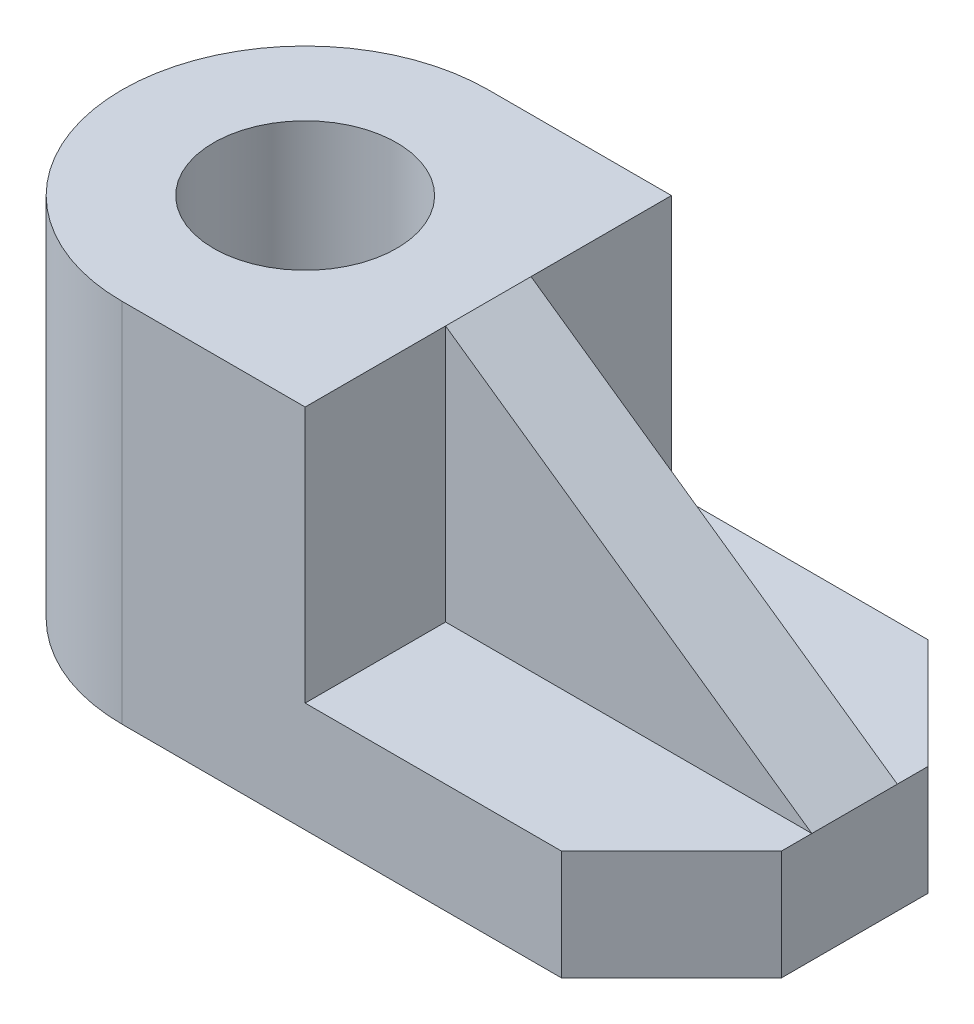
ISO-10303-21;
HEADER;
FILE_DESCRIPTION(('STEP AP214'),'2;1');
FILE_NAME('part.step','',(''),(''),'','','');
FILE_SCHEMA(('AUTOMOTIVE_DESIGN { 1 0 10303 214 1 1 1 1 }'));
ENDSEC;
DATA;
#1=APPLICATION_CONTEXT('core data for automotive mechanical design processes');
#2=APPLICATION_PROTOCOL_DEFINITION('international standard','automotive_design',2000,#1);
#3=PRODUCT_CONTEXT('',#1,'mechanical');
#4=PRODUCT('Part','Part','',(#3));
#5=PRODUCT_RELATED_PRODUCT_CATEGORY('part','',(#4));
#6=PRODUCT_DEFINITION_FORMATION('','',#4);
#7=PRODUCT_DEFINITION_CONTEXT('part definition',#1,'design');
#8=PRODUCT_DEFINITION('design','',#6,#7);
#9=PRODUCT_DEFINITION_SHAPE('','',#8);
#10=(LENGTH_UNIT() NAMED_UNIT(*) SI_UNIT(.MILLI.,.METRE.));
#11=(NAMED_UNIT(*) PLANE_ANGLE_UNIT() SI_UNIT($,.RADIAN.));
#12=(NAMED_UNIT(*) SI_UNIT($,.STERADIAN.) SOLID_ANGLE_UNIT());
#13=UNCERTAINTY_MEASURE_WITH_UNIT(LENGTH_MEASURE(1.E-05),#10,'distance_accuracy_value','');
#14=(GEOMETRIC_REPRESENTATION_CONTEXT(3) GLOBAL_UNCERTAINTY_ASSIGNED_CONTEXT((#13)) GLOBAL_UNIT_ASSIGNED_CONTEXT((#10,
#11,#12)) REPRESENTATION_CONTEXT('',''));
#15=CARTESIAN_POINT('',(0.,0.,0.));
#16=DIRECTION('',(0.,0.,1.));
#17=DIRECTION('',(1.,0.,0.));
#18=AXIS2_PLACEMENT_3D('',#15,#16,#17);
#19=CARTESIAN_POINT('',(1524.,0.,-381.));
#20=DIRECTION('',(0.,-1.,0.));
#21=DIRECTION('',(1.,0.,0.));
#22=AXIS2_PLACEMENT_3D('',#19,#20,#21);
#23=PLANE('',#22);
#24=CARTESIAN_POINT('',(381.,0.,0.));
#25=DIRECTION('',(0.,1.,0.));
#26=DIRECTION('',(0.,0.,1.));
#27=AXIS2_PLACEMENT_3D('',#24,#25,#26);
#28=CIRCLE('',#27,190.5);
#29=CARTESIAN_POINT('',(381.,0.,190.5));
#30=VERTEX_POINT('',#29);
#31=EDGE_CURVE('E236',#30,#30,#28,.T.);
#32=ORIENTED_EDGE('',*,*,#31,.T.);
#33=EDGE_LOOP('',(#32));
#34=FACE_BOUND('',#33,.T.);
#35=DIRECTION('',(0.,0.,1.));
#36=VECTOR('',#35,1.);
#37=CARTESIAN_POINT('',(1524.,0.,-381.));
#38=LINE('',#37,#36);
#39=CARTESIAN_POINT('',(1524.,0.,-152.4));
#40=VERTEX_POINT('',#39);
#41=CARTESIAN_POINT('',(1524.,0.,152.399999999999));
#42=VERTEX_POINT('',#41);
#43=EDGE_CURVE('E155',#40,#42,#38,.T.);
#44=ORIENTED_EDGE('',*,*,#43,.T.);
#45=DIRECTION('',(-0.707106781186546,0.,0.707106781186549));
#46=VECTOR('',#45,1.);
#47=CARTESIAN_POINT('',(1790.7,0.,-114.300000000001));
#48=LINE('',#47,#46);
#49=CARTESIAN_POINT('',(1295.4,0.,381.));
#50=VERTEX_POINT('',#49);
#51=EDGE_CURVE('E192',#42,#50,#48,.T.);
#52=ORIENTED_EDGE('',*,*,#51,.T.);
#53=DIRECTION('',(1.,0.,0.));
#54=VECTOR('',#53,1.);
#55=CARTESIAN_POINT('',(1524.,0.,381.));
#56=LINE('',#55,#54);
#57=CARTESIAN_POINT('',(381.,0.,381.));
#58=VERTEX_POINT('',#57);
#59=EDGE_CURVE('E180',#58,#50,#56,.T.);
#60=ORIENTED_EDGE('',*,*,#59,.F.);
#61=CARTESIAN_POINT('',(381.,0.,0.));
#62=DIRECTION('',(0.,-1.,0.));
#63=DIRECTION('',(1.,0.,0.));
#64=AXIS2_PLACEMENT_3D('',#61,#62,#63);
#65=CIRCLE('',#64,381.);
#66=CARTESIAN_POINT('',(0.,0.,0.));
#67=VERTEX_POINT('',#66);
#68=EDGE_CURVE('E164',#58,#67,#65,.T.);
#69=ORIENTED_EDGE('',*,*,#68,.T.);
#70=CARTESIAN_POINT('',(381.,0.,0.));
#71=DIRECTION('',(0.,-1.,0.));
#72=DIRECTION('',(1.,0.,0.));
#73=AXIS2_PLACEMENT_3D('',#70,#71,#72);
#74=CIRCLE('',#73,381.);
#75=CARTESIAN_POINT('',(381.,0.,-381.));
#76=VERTEX_POINT('',#75);
#77=EDGE_CURVE('E166',#67,#76,#74,.T.);
#78=ORIENTED_EDGE('',*,*,#77,.T.);
#79=DIRECTION('',(1.,0.,0.));
#80=VECTOR('',#79,1.);
#81=CARTESIAN_POINT('',(1524.,0.,-381.));
#82=LINE('',#81,#80);
#83=CARTESIAN_POINT('',(1295.4,0.,-381.));
#84=VERTEX_POINT('',#83);
#85=EDGE_CURVE('E212',#76,#84,#82,.T.);
#86=ORIENTED_EDGE('',*,*,#85,.T.);
#87=DIRECTION('',(-0.707106781186549,0.,-0.707106781186546));
#88=VECTOR('',#87,1.);
#89=CARTESIAN_POINT('',(1409.7,0.,-266.7));
#90=LINE('',#89,#88);
#91=EDGE_CURVE('E190',#84,#40,#90,.F.);
#92=ORIENTED_EDGE('',*,*,#91,.T.);
#93=EDGE_LOOP('',(#44,#52,#60,#69,#78,#86,#92));
#94=FACE_BOUND('',#93,.T.);
#95=ADVANCED_FACE('F33',(#34,#94),#23,.T.);
#96=CARTESIAN_POINT('',(0.,762.,-381.));
#97=DIRECTION('',(0.,1.,0.));
#98=DIRECTION('',(0.,0.,1.));
#99=AXIS2_PLACEMENT_3D('',#96,#97,#98);
#100=PLANE('',#99);
#101=CARTESIAN_POINT('',(381.,762.,0.));
#102=DIRECTION('',(0.,1.,0.));
#103=DIRECTION('',(0.,0.,1.));
#104=AXIS2_PLACEMENT_3D('',#101,#102,#103);
#105=CIRCLE('',#104,190.5);
#106=CARTESIAN_POINT('',(381.,762.,190.5));
#107=VERTEX_POINT('',#106);
#108=EDGE_CURVE('E239',#107,#107,#105,.T.);
#109=ORIENTED_EDGE('',*,*,#108,.F.);
#110=EDGE_LOOP('',(#109));
#111=FACE_BOUND('',#110,.T.);
#112=DIRECTION('',(-1.,0.,0.));
#113=VECTOR('',#112,1.);
#114=CARTESIAN_POINT('',(0.,762.,-381.));
#115=LINE('',#114,#113);
#116=CARTESIAN_POINT('',(762.,762.,-381.));
#117=VERTEX_POINT('',#116);
#118=CARTESIAN_POINT('',(381.,762.,-381.));
#119=VERTEX_POINT('',#118);
#120=EDGE_CURVE('E158',#117,#119,#115,.T.);
#121=ORIENTED_EDGE('',*,*,#120,.T.);
#122=CARTESIAN_POINT('',(381.,762.,0.));
#123=DIRECTION('',(0.,1.,0.));
#124=DIRECTION('',(0.,0.,1.));
#125=AXIS2_PLACEMENT_3D('',#122,#123,#124);
#126=CIRCLE('',#125,381.);
#127=CARTESIAN_POINT('',(0.,762.,0.));
#128=VERTEX_POINT('',#127);
#129=EDGE_CURVE('E173',#119,#128,#126,.T.);
#130=ORIENTED_EDGE('',*,*,#129,.T.);
#131=CARTESIAN_POINT('',(381.,762.,0.));
#132=DIRECTION('',(0.,1.,0.));
#133=DIRECTION('',(0.,0.,1.));
#134=AXIS2_PLACEMENT_3D('',#131,#132,#133);
#135=CIRCLE('',#134,381.);
#136=CARTESIAN_POINT('',(381.,762.,381.));
#137=VERTEX_POINT('',#136);
#138=EDGE_CURVE('E171',#128,#137,#135,.T.);
#139=ORIENTED_EDGE('',*,*,#138,.T.);
#140=DIRECTION('',(-1.,0.,0.));
#141=VECTOR('',#140,1.);
#142=CARTESIAN_POINT('',(0.,762.,381.));
#143=LINE('',#142,#141);
#144=CARTESIAN_POINT('',(762.,762.,381.));
#145=VERTEX_POINT('',#144);
#146=EDGE_CURVE('E206',#145,#137,#143,.T.);
#147=ORIENTED_EDGE('',*,*,#146,.F.);
#148=DIRECTION('',(0.,0.,1.));
#149=VECTOR('',#148,1.);
#150=CARTESIAN_POINT('',(762.,762.,381.));
#151=LINE('',#150,#149);
#152=CARTESIAN_POINT('',(762.,762.,88.9));
#153=VERTEX_POINT('',#152);
#154=EDGE_CURVE('E234',#153,#145,#151,.T.);
#155=ORIENTED_EDGE('',*,*,#154,.F.);
#156=DIRECTION('',(0.,0.,1.));
#157=VECTOR('',#156,1.);
#158=CARTESIAN_POINT('',(762.,762.,-381.));
#159=LINE('',#158,#157);
#160=CARTESIAN_POINT('',(762.,762.,-88.9));
#161=VERTEX_POINT('',#160);
#162=EDGE_CURVE('E147',#161,#153,#159,.T.);
#163=ORIENTED_EDGE('',*,*,#162,.F.);
#164=EDGE_CURVE('E161',#117,#161,#159,.T.);
#165=ORIENTED_EDGE('',*,*,#164,.F.);
#166=EDGE_LOOP('',(#121,#130,#139,#147,#155,#163,#165));
#167=FACE_BOUND('',#166,.T.);
#168=ADVANCED_FACE('F252',(#111,#167),#100,.T.);
#169=CARTESIAN_POINT('',(762.,762.,-381.));
#170=DIRECTION('',(0.573462344363328,0.81923192051904,0.));
#171=DIRECTION('',(-0.81923192051904,0.573462344363328,0.));
#172=AXIS2_PLACEMENT_3D('',#169,#170,#171);
#173=PLANE('',#172);
#174=DIRECTION('',(-0.81923192051904,0.573462344363328,0.));
#175=VECTOR('',#174,1.);
#176=CARTESIAN_POINT('',(762.,762.,88.9));
#177=LINE('',#176,#175);
#178=CARTESIAN_POINT('',(1524.,228.6,88.9));
#179=VERTEX_POINT('',#178);
#180=EDGE_CURVE('E135',#179,#153,#177,.T.);
#181=ORIENTED_EDGE('',*,*,#180,.F.);
#182=DIRECTION('',(0.,0.,1.));
#183=VECTOR('',#182,1.);
#184=CARTESIAN_POINT('',(1524.,228.6,-381.));
#185=LINE('',#184,#183);
#186=CARTESIAN_POINT('',(1524.,228.6,-88.9));
#187=VERTEX_POINT('',#186);
#188=EDGE_CURVE('E145',#187,#179,#185,.T.);
#189=ORIENTED_EDGE('',*,*,#188,.F.);
#190=DIRECTION('',(0.81923192051904,-0.573462344363328,0.));
#191=VECTOR('',#190,1.);
#192=CARTESIAN_POINT('',(762.,762.,-88.9));
#193=LINE('',#192,#191);
#194=EDGE_CURVE('E149',#161,#187,#193,.T.);
#195=ORIENTED_EDGE('',*,*,#194,.F.);
#196=ORIENTED_EDGE('',*,*,#162,.T.);
#197=EDGE_LOOP('',(#181,#189,#195,#196));
#198=FACE_BOUND('',#197,.T.);
#199=ADVANCED_FACE('F143',(#198),#173,.T.);
#200=CARTESIAN_POINT('',(1524.,228.6,-381.));
#201=DIRECTION('',(1.,0.,0.));
#202=DIRECTION('',(0.,0.,-1.));
#203=AXIS2_PLACEMENT_3D('',#200,#201,#202);
#204=PLANE('',#203);
#205=DIRECTION('',(0.,0.,-1.));
#206=VECTOR('',#205,1.);
#207=CARTESIAN_POINT('',(1524.,228.6,381.));
#208=LINE('',#207,#206);
#209=CARTESIAN_POINT('',(1524.,228.6,152.399999999999));
#210=VERTEX_POINT('',#209);
#211=EDGE_CURVE('E120',#210,#179,#208,.T.);
#212=ORIENTED_EDGE('',*,*,#211,.F.);
#213=DIRECTION('',(0.,-1.,0.));
#214=VECTOR('',#213,1.);
#215=CARTESIAN_POINT('',(1524.,0.,152.399999999999));
#216=LINE('',#215,#214);
#217=EDGE_CURVE('E188',#210,#42,#216,.T.);
#218=ORIENTED_EDGE('',*,*,#217,.T.);
#219=ORIENTED_EDGE('',*,*,#43,.F.);
#220=DIRECTION('',(0.,1.,0.));
#221=VECTOR('',#220,1.);
#222=CARTESIAN_POINT('',(1524.,228.6,-152.4));
#223=LINE('',#222,#221);
#224=CARTESIAN_POINT('',(1524.,228.6,-152.4));
#225=VERTEX_POINT('',#224);
#226=EDGE_CURVE('E186',#40,#225,#223,.T.);
#227=ORIENTED_EDGE('',*,*,#226,.T.);
#228=EDGE_CURVE('E153',#225,#187,#185,.T.);
#229=ORIENTED_EDGE('',*,*,#228,.T.);
#230=ORIENTED_EDGE('',*,*,#188,.T.);
#231=EDGE_LOOP('',(#212,#218,#219,#227,#229,#230));
#232=FACE_BOUND('',#231,.T.);
#233=ADVANCED_FACE('F151',(#232),#204,.T.);
#234=CARTESIAN_POINT('',(0.,0.,-381.));
#235=DIRECTION('',(0.,0.,-1.));
#236=DIRECTION('',(-1.,0.,0.));
#237=AXIS2_PLACEMENT_3D('',#234,#235,#236);
#238=PLANE('',#237);
#239=DIRECTION('',(-1.,0.,0.));
#240=VECTOR('',#239,1.);
#241=CARTESIAN_POINT('',(762.,228.6,-381.));
#242=LINE('',#241,#240);
#243=CARTESIAN_POINT('',(1295.4,228.6,-381.));
#244=VERTEX_POINT('',#243);
#245=CARTESIAN_POINT('',(762.,228.6,-381.));
#246=VERTEX_POINT('',#245);
#247=EDGE_CURVE('E221',#244,#246,#242,.T.);
#248=ORIENTED_EDGE('',*,*,#247,.F.);
#249=DIRECTION('',(0.,-1.,0.));
#250=VECTOR('',#249,1.);
#251=CARTESIAN_POINT('',(1295.4,0.,-381.));
#252=LINE('',#251,#250);
#253=EDGE_CURVE('E11',#244,#84,#252,.T.);
#254=ORIENTED_EDGE('',*,*,#253,.T.);
#255=ORIENTED_EDGE('',*,*,#85,.F.);
#256=DIRECTION('',(0.,-1.,0.));
#257=VECTOR('',#256,1.);
#258=CARTESIAN_POINT('',(381.,0.,-381.));
#259=LINE('',#258,#257);
#260=EDGE_CURVE('E168',#76,#119,#259,.F.);
#261=ORIENTED_EDGE('',*,*,#260,.T.);
#262=ORIENTED_EDGE('',*,*,#120,.F.);
#263=DIRECTION('',(0.,1.,0.));
#264=VECTOR('',#263,1.);
#265=CARTESIAN_POINT('',(762.,228.6,-381.));
#266=LINE('',#265,#264);
#267=EDGE_CURVE('E181',#246,#117,#266,.T.);
#268=ORIENTED_EDGE('',*,*,#267,.F.);
#269=EDGE_LOOP('',(#248,#254,#255,#261,#262,#268));
#270=FACE_BOUND('',#269,.T.);
#271=ADVANCED_FACE('F261',(#270),#238,.T.);
#272=CARTESIAN_POINT('',(0.,0.,381.));
#273=DIRECTION('',(0.,0.,-1.));
#274=DIRECTION('',(-1.,0.,0.));
#275=AXIS2_PLACEMENT_3D('',#272,#273,#274);
#276=PLANE('',#275);
#277=ORIENTED_EDGE('',*,*,#59,.T.);
#278=DIRECTION('',(0.,1.,0.));
#279=VECTOR('',#278,1.);
#280=CARTESIAN_POINT('',(1295.4,228.6,381.));
#281=LINE('',#280,#279);
#282=CARTESIAN_POINT('',(1295.4,228.6,381.));
#283=VERTEX_POINT('',#282);
#284=EDGE_CURVE('E148',#50,#283,#281,.T.);
#285=ORIENTED_EDGE('',*,*,#284,.T.);
#286=DIRECTION('',(1.,0.,0.));
#287=VECTOR('',#286,1.);
#288=CARTESIAN_POINT('',(762.,228.6,381.));
#289=LINE('',#288,#287);
#290=CARTESIAN_POINT('',(762.,228.6,381.));
#291=VERTEX_POINT('',#290);
#292=EDGE_CURVE('E130',#291,#283,#289,.T.);
#293=ORIENTED_EDGE('',*,*,#292,.F.);
#294=DIRECTION('',(0.,1.,0.));
#295=VECTOR('',#294,1.);
#296=CARTESIAN_POINT('',(762.,228.6,381.));
#297=LINE('',#296,#295);
#298=EDGE_CURVE('E230',#291,#145,#297,.T.);
#299=ORIENTED_EDGE('',*,*,#298,.T.);
#300=ORIENTED_EDGE('',*,*,#146,.T.);
#301=DIRECTION('',(0.,-1.,0.));
#302=VECTOR('',#301,1.);
#303=CARTESIAN_POINT('',(381.,0.,381.));
#304=LINE('',#303,#302);
#305=EDGE_CURVE('E175',#137,#58,#304,.T.);
#306=ORIENTED_EDGE('',*,*,#305,.T.);
#307=EDGE_LOOP('',(#277,#285,#293,#299,#300,#306));
#308=FACE_BOUND('',#307,.T.);
#309=ADVANCED_FACE('F202',(#308),#276,.F.);
#310=CARTESIAN_POINT('',(381.,0.,0.));
#311=DIRECTION('',(0.,1.,0.));
#312=DIRECTION('',(0.,0.,1.));
#313=AXIS2_PLACEMENT_3D('',#310,#311,#312);
#314=CYLINDRICAL_SURFACE('',#313,381.);
#315=ORIENTED_EDGE('',*,*,#305,.F.);
#316=ORIENTED_EDGE('',*,*,#138,.F.);
#317=DIRECTION('',(0.,-1.,0.));
#318=VECTOR('',#317,1.);
#319=CARTESIAN_POINT('',(0.,762.,0.));
#320=LINE('',#319,#318);
#321=EDGE_CURVE('E177',#67,#128,#320,.F.);
#322=ORIENTED_EDGE('',*,*,#321,.F.);
#323=ORIENTED_EDGE('',*,*,#68,.F.);
#324=EDGE_LOOP('',(#315,#316,#322,#323));
#325=FACE_BOUND('',#324,.T.);
#326=ADVANCED_FACE('F266',(#325),#314,.T.);
#327=CARTESIAN_POINT('',(381.,0.,0.));
#328=DIRECTION('',(0.,-1.,0.));
#329=DIRECTION('',(0.,0.,-1.));
#330=AXIS2_PLACEMENT_3D('',#327,#328,#329);
#331=CYLINDRICAL_SURFACE('',#330,381.);
#332=ORIENTED_EDGE('',*,*,#129,.F.);
#333=ORIENTED_EDGE('',*,*,#260,.F.);
#334=ORIENTED_EDGE('',*,*,#77,.F.);
#335=ORIENTED_EDGE('',*,*,#321,.T.);
#336=EDGE_LOOP('',(#332,#333,#334,#335));
#337=FACE_BOUND('',#336,.T.);
#338=ADVANCED_FACE('F263',(#337),#331,.T.);
#339=CARTESIAN_POINT('',(762.,228.6,-381.));
#340=DIRECTION('',(-1.,0.,0.));
#341=DIRECTION('',(0.,0.,1.));
#342=AXIS2_PLACEMENT_3D('',#339,#340,#341);
#343=PLANE('',#342);
#344=ORIENTED_EDGE('',*,*,#164,.T.);
#345=DIRECTION('',(0.,1.,0.));
#346=VECTOR('',#345,1.);
#347=CARTESIAN_POINT('',(762.,228.6,-88.9));
#348=LINE('',#347,#346);
#349=CARTESIAN_POINT('',(762.,228.6,-88.9));
#350=VERTEX_POINT('',#349);
#351=EDGE_CURVE('E219',#350,#161,#348,.T.);
#352=ORIENTED_EDGE('',*,*,#351,.F.);
#353=DIRECTION('',(0.,0.,1.));
#354=VECTOR('',#353,1.);
#355=CARTESIAN_POINT('',(762.,228.6,-381.));
#356=LINE('',#355,#354);
#357=EDGE_CURVE('E227',#246,#350,#356,.T.);
#358=ORIENTED_EDGE('',*,*,#357,.F.);
#359=ORIENTED_EDGE('',*,*,#267,.T.);
#360=EDGE_LOOP('',(#344,#352,#358,#359));
#361=FACE_BOUND('',#360,.T.);
#362=ADVANCED_FACE('F273',(#361),#343,.F.);
#363=CARTESIAN_POINT('',(762.,228.6,-88.9));
#364=DIRECTION('',(0.,0.,1.));
#365=DIRECTION('',(1.,0.,0.));
#366=AXIS2_PLACEMENT_3D('',#363,#364,#365);
#367=PLANE('',#366);
#368=ORIENTED_EDGE('',*,*,#194,.T.);
#369=DIRECTION('',(1.,0.,0.));
#370=VECTOR('',#369,1.);
#371=CARTESIAN_POINT('',(762.,228.6,-88.9));
#372=LINE('',#371,#370);
#373=EDGE_CURVE('E224',#350,#187,#372,.T.);
#374=ORIENTED_EDGE('',*,*,#373,.F.);
#375=ORIENTED_EDGE('',*,*,#351,.T.);
#376=EDGE_LOOP('',(#368,#374,#375));
#377=FACE_BOUND('',#376,.T.);
#378=ADVANCED_FACE('F277',(#377),#367,.F.);
#379=CARTESIAN_POINT('',(0.,228.6,0.));
#380=DIRECTION('',(0.,1.,0.));
#381=DIRECTION('',(0.,0.,1.));
#382=AXIS2_PLACEMENT_3D('',#379,#380,#381);
#383=PLANE('',#382);
#384=ORIENTED_EDGE('',*,*,#228,.F.);
#385=DIRECTION('',(0.707106781186549,0.,0.707106781186546));
#386=VECTOR('',#385,1.);
#387=CARTESIAN_POINT('',(838.199999999997,228.6,-838.200000000001));
#388=LINE('',#387,#386);
#389=EDGE_CURVE('E41',#225,#244,#388,.F.);
#390=ORIENTED_EDGE('',*,*,#389,.T.);
#391=ORIENTED_EDGE('',*,*,#247,.T.);
#392=ORIENTED_EDGE('',*,*,#357,.T.);
#393=ORIENTED_EDGE('',*,*,#373,.T.);
#394=EDGE_LOOP('',(#384,#390,#391,#392,#393));
#395=FACE_BOUND('',#394,.T.);
#396=ADVANCED_FACE('F278',(#395),#383,.T.);
#397=CARTESIAN_POINT('',(762.,228.6,381.));
#398=DIRECTION('',(-1.,0.,0.));
#399=DIRECTION('',(0.,0.,1.));
#400=AXIS2_PLACEMENT_3D('',#397,#398,#399);
#401=PLANE('',#400);
#402=ORIENTED_EDGE('',*,*,#154,.T.);
#403=ORIENTED_EDGE('',*,*,#298,.F.);
#404=DIRECTION('',(0.,0.,1.));
#405=VECTOR('',#404,1.);
#406=CARTESIAN_POINT('',(762.,228.6,381.));
#407=LINE('',#406,#405);
#408=CARTESIAN_POINT('',(762.,228.6,88.9));
#409=VERTEX_POINT('',#408);
#410=EDGE_CURVE('E138',#409,#291,#407,.T.);
#411=ORIENTED_EDGE('',*,*,#410,.F.);
#412=DIRECTION('',(0.,1.,0.));
#413=VECTOR('',#412,1.);
#414=CARTESIAN_POINT('',(762.,228.6,88.9));
#415=LINE('',#414,#413);
#416=EDGE_CURVE('E137',#409,#153,#415,.T.);
#417=ORIENTED_EDGE('',*,*,#416,.T.);
#418=EDGE_LOOP('',(#402,#403,#411,#417));
#419=FACE_BOUND('',#418,.T.);
#420=ADVANCED_FACE('F271',(#419),#401,.F.);
#421=CARTESIAN_POINT('',(762.,228.6,88.9));
#422=DIRECTION('',(0.,0.,-1.));
#423=DIRECTION('',(-1.,0.,0.));
#424=AXIS2_PLACEMENT_3D('',#421,#422,#423);
#425=PLANE('',#424);
#426=ORIENTED_EDGE('',*,*,#180,.T.);
#427=ORIENTED_EDGE('',*,*,#416,.F.);
#428=DIRECTION('',(-1.,0.,0.));
#429=VECTOR('',#428,1.);
#430=CARTESIAN_POINT('',(762.,228.6,88.9));
#431=LINE('',#430,#429);
#432=EDGE_CURVE('E124',#179,#409,#431,.T.);
#433=ORIENTED_EDGE('',*,*,#432,.F.);
#434=EDGE_LOOP('',(#426,#427,#433));
#435=FACE_BOUND('',#434,.T.);
#436=ADVANCED_FACE('F134',(#435),#425,.F.);
#437=CARTESIAN_POINT('',(0.,228.6,0.));
#438=DIRECTION('',(0.,1.,0.));
#439=DIRECTION('',(0.,0.,1.));
#440=AXIS2_PLACEMENT_3D('',#437,#438,#439);
#441=PLANE('',#440);
#442=ORIENTED_EDGE('',*,*,#292,.T.);
#443=DIRECTION('',(0.707106781186546,0.,-0.707106781186549));
#444=VECTOR('',#443,1.);
#445=CARTESIAN_POINT('',(838.200000000003,228.6,838.199999999999));
#446=LINE('',#445,#444);
#447=EDGE_CURVE('E126',#283,#210,#446,.T.);
#448=ORIENTED_EDGE('',*,*,#447,.T.);
#449=ORIENTED_EDGE('',*,*,#211,.T.);
#450=ORIENTED_EDGE('',*,*,#432,.T.);
#451=ORIENTED_EDGE('',*,*,#410,.T.);
#452=EDGE_LOOP('',(#442,#448,#449,#450,#451));
#453=FACE_BOUND('',#452,.T.);
#454=ADVANCED_FACE('F123',(#453),#441,.T.);
#455=CARTESIAN_POINT('',(381.,0.,0.));
#456=DIRECTION('',(0.,1.,0.));
#457=DIRECTION('',(0.,0.,1.));
#458=AXIS2_PLACEMENT_3D('',#455,#456,#457);
#459=CYLINDRICAL_SURFACE('',#458,190.5);
#460=ORIENTED_EDGE('',*,*,#31,.F.);
#461=EDGE_LOOP('',(#460));
#462=FACE_BOUND('',#461,.T.);
#463=ORIENTED_EDGE('',*,*,#108,.T.);
#464=EDGE_LOOP('',(#463));
#465=FACE_BOUND('',#464,.T.);
#466=ADVANCED_FACE('F246',(#462,#465),#459,.F.);
#467=CARTESIAN_POINT('',(1295.4,0.,381.));
#468=DIRECTION('',(0.707106781186549,0.,0.707106781186546));
#469=DIRECTION('',(0.,-1.,0.));
#470=AXIS2_PLACEMENT_3D('',#467,#468,#469);
#471=PLANE('',#470);
#472=ORIENTED_EDGE('',*,*,#51,.F.);
#473=ORIENTED_EDGE('',*,*,#217,.F.);
#474=ORIENTED_EDGE('',*,*,#447,.F.);
#475=ORIENTED_EDGE('',*,*,#284,.F.);
#476=EDGE_LOOP('',(#472,#473,#474,#475));
#477=FACE_BOUND('',#476,.T.);
#478=ADVANCED_FACE('F208',(#477),#471,.T.);
#479=CARTESIAN_POINT('',(1524.,228.6,-152.4));
#480=DIRECTION('',(-0.707106781186546,0.,0.707106781186549));
#481=DIRECTION('',(0.,1.,0.));
#482=AXIS2_PLACEMENT_3D('',#479,#480,#481);
#483=PLANE('',#482);
#484=ORIENTED_EDGE('',*,*,#91,.F.);
#485=ORIENTED_EDGE('',*,*,#253,.F.);
#486=ORIENTED_EDGE('',*,*,#389,.F.);
#487=ORIENTED_EDGE('',*,*,#226,.F.);
#488=EDGE_LOOP('',(#484,#485,#486,#487));
#489=FACE_BOUND('',#488,.T.);
#490=ADVANCED_FACE('F35',(#489),#483,.F.);
#491=CLOSED_SHELL('',(#95,#168,#199,#233,#271,#309,#326,#338,#362,#378,#396,#420,#436,#454,#466,
#478,#490));
#492=MANIFOLD_SOLID_BREP('B2',#491);
#493=ADVANCED_BREP_SHAPE_REPRESENTATION('',(#18,#492),#14);
#494=SHAPE_DEFINITION_REPRESENTATION(#9,#493);
ENDSEC;
END-ISO-10303-21;
